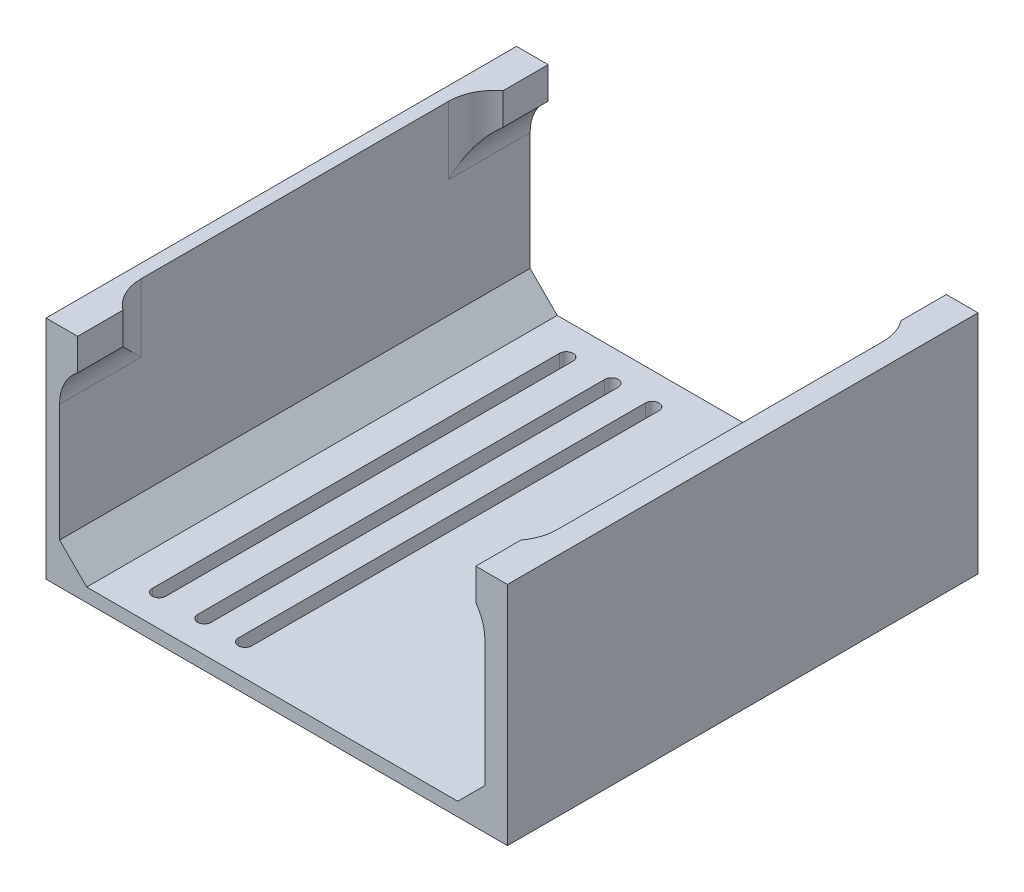
ISO-10303-21;
HEADER;
FILE_DESCRIPTION(('STEP AP214'),'2;1');
FILE_NAME('part.step','',(''),(''),'','','');
FILE_SCHEMA(('AUTOMOTIVE_DESIGN { 1 0 10303 214 1 1 1 1 }'));
ENDSEC;
DATA;
#1=APPLICATION_CONTEXT('core data for automotive mechanical design processes');
#2=APPLICATION_PROTOCOL_DEFINITION('international standard','automotive_design',2000,#1);
#3=PRODUCT_CONTEXT('',#1,'mechanical');
#4=PRODUCT('Part','Part','',(#3));
#5=PRODUCT_RELATED_PRODUCT_CATEGORY('part','',(#4));
#6=PRODUCT_DEFINITION_FORMATION('','',#4);
#7=PRODUCT_DEFINITION_CONTEXT('part definition',#1,'design');
#8=PRODUCT_DEFINITION('design','',#6,#7);
#9=PRODUCT_DEFINITION_SHAPE('','',#8);
#10=(LENGTH_UNIT() NAMED_UNIT(*) SI_UNIT(.MILLI.,.METRE.));
#11=(NAMED_UNIT(*) PLANE_ANGLE_UNIT() SI_UNIT($,.RADIAN.));
#12=(NAMED_UNIT(*) SI_UNIT($,.STERADIAN.) SOLID_ANGLE_UNIT());
#13=UNCERTAINTY_MEASURE_WITH_UNIT(LENGTH_MEASURE(1.E-05),#10,'distance_accuracy_value','');
#14=(GEOMETRIC_REPRESENTATION_CONTEXT(3) GLOBAL_UNCERTAINTY_ASSIGNED_CONTEXT((#13)) GLOBAL_UNIT_ASSIGNED_CONTEXT((#10,
#11,#12)) REPRESENTATION_CONTEXT('',''));
#15=CARTESIAN_POINT('',(0.,0.,0.));
#16=DIRECTION('',(0.,0.,1.));
#17=DIRECTION('',(1.,0.,0.));
#18=AXIS2_PLACEMENT_3D('',#15,#16,#17);
#19=CARTESIAN_POINT('',(52.,0.,0.));
#20=DIRECTION('',(1.,0.,0.));
#21=DIRECTION('',(0.,0.,-1.));
#22=AXIS2_PLACEMENT_3D('',#19,#20,#21);
#23=PLANE('',#22);
#24=DIRECTION('',(0.,1.,0.));
#25=VECTOR('',#24,1.);
#26=CARTESIAN_POINT('',(52.,-188.,107.));
#27=LINE('',#26,#25);
#28=CARTESIAN_POINT('',(52.,-50.,107.));
#29=VERTEX_POINT('',#28);
#30=CARTESIAN_POINT('',(52.,0.,107.));
#31=VERTEX_POINT('',#30);
#32=EDGE_CURVE('E376',#29,#31,#27,.T.);
#33=ORIENTED_EDGE('',*,*,#32,.F.);
#34=DIRECTION('',(0.,0.,1.));
#35=VECTOR('',#34,1.);
#36=CARTESIAN_POINT('',(52.,-50.,107.));
#37=LINE('',#36,#35);
#38=CARTESIAN_POINT('',(52.,-50.,3.));
#39=VERTEX_POINT('',#38);
#40=EDGE_CURVE('E374',#39,#29,#37,.T.);
#41=ORIENTED_EDGE('',*,*,#40,.F.);
#42=DIRECTION('',(0.,1.,0.));
#43=VECTOR('',#42,1.);
#44=CARTESIAN_POINT('',(52.,-188.,3.));
#45=LINE('',#44,#43);
#46=CARTESIAN_POINT('',(52.,0.,3.));
#47=VERTEX_POINT('',#46);
#48=EDGE_CURVE('E382',#39,#47,#45,.T.);
#49=ORIENTED_EDGE('',*,*,#48,.T.);
#50=DIRECTION('',(0.,0.,1.));
#51=VECTOR('',#50,1.);
#52=CARTESIAN_POINT('',(52.,0.,3.));
#53=LINE('',#52,#51);
#54=EDGE_CURVE('E379',#47,#31,#53,.T.);
#55=ORIENTED_EDGE('',*,*,#54,.T.);
#56=EDGE_LOOP('',(#33,#41,#49,#55));
#57=FACE_BOUND('',#56,.T.);
#58=ADVANCED_FACE('F36',(#57),#23,.T.);
#59=CARTESIAN_POINT('',(0.,-50.,0.));
#60=DIRECTION('',(0.,-1.,0.));
#61=DIRECTION('',(0.,0.,-1.));
#62=AXIS2_PLACEMENT_3D('',#59,#60,#61);
#63=PLANE('',#62);
#64=DIRECTION('',(0.,0.,1.));
#65=VECTOR('',#64,1.);
#66=CARTESIAN_POINT('',(-11.5,-50.,10.));
#67=LINE('',#66,#65);
#68=CARTESIAN_POINT('',(-11.5,-50.,10.));
#69=VERTEX_POINT('',#68);
#70=CARTESIAN_POINT('',(-11.5,-50.,100.));
#71=VERTEX_POINT('',#70);
#72=EDGE_CURVE('E305',#69,#71,#67,.T.);
#73=ORIENTED_EDGE('',*,*,#72,.F.);
#74=CARTESIAN_POINT('',(-13.,-50.,10.));
#75=DIRECTION('',(0.,-1.,0.));
#76=DIRECTION('',(0.,0.,-1.));
#77=AXIS2_PLACEMENT_3D('',#74,#75,#76);
#78=CIRCLE('',#77,1.5);
#79=CARTESIAN_POINT('',(-14.5,-50.,10.));
#80=VERTEX_POINT('',#79);
#81=EDGE_CURVE('E297',#80,#69,#78,.T.);
#82=ORIENTED_EDGE('',*,*,#81,.F.);
#83=DIRECTION('',(0.,0.,-1.));
#84=VECTOR('',#83,1.);
#85=CARTESIAN_POINT('',(-14.5,-50.,10.));
#86=LINE('',#85,#84);
#87=CARTESIAN_POINT('',(-14.5,-50.,100.));
#88=VERTEX_POINT('',#87);
#89=EDGE_CURVE('E311',#88,#80,#86,.T.);
#90=ORIENTED_EDGE('',*,*,#89,.F.);
#91=CARTESIAN_POINT('',(-13.,-50.,100.));
#92=DIRECTION('',(0.,-1.,0.));
#93=DIRECTION('',(0.,0.,-1.));
#94=AXIS2_PLACEMENT_3D('',#91,#92,#93);
#95=CIRCLE('',#94,1.5);
#96=EDGE_CURVE('E308',#71,#88,#95,.T.);
#97=ORIENTED_EDGE('',*,*,#96,.F.);
#98=EDGE_LOOP('',(#73,#82,#90,#97));
#99=FACE_BOUND('',#98,.T.);
#100=DIRECTION('',(0.,0.,1.));
#101=VECTOR('',#100,1.);
#102=CARTESIAN_POINT('',(-20.5,-50.,10.));
#103=LINE('',#102,#101);
#104=CARTESIAN_POINT('',(-20.5,-50.,10.));
#105=VERTEX_POINT('',#104);
#106=CARTESIAN_POINT('',(-20.5,-50.,100.));
#107=VERTEX_POINT('',#106);
#108=EDGE_CURVE('E285',#105,#107,#103,.T.);
#109=ORIENTED_EDGE('',*,*,#108,.F.);
#110=CARTESIAN_POINT('',(-22.,-50.,10.));
#111=DIRECTION('',(0.,-1.,0.));
#112=DIRECTION('',(0.,0.,-1.));
#113=AXIS2_PLACEMENT_3D('',#110,#111,#112);
#114=CIRCLE('',#113,1.5);
#115=CARTESIAN_POINT('',(-23.5,-50.,10.));
#116=VERTEX_POINT('',#115);
#117=EDGE_CURVE('E281',#116,#105,#114,.T.);
#118=ORIENTED_EDGE('',*,*,#117,.F.);
#119=DIRECTION('',(0.,0.,-1.));
#120=VECTOR('',#119,1.);
#121=CARTESIAN_POINT('',(-23.5,-50.,10.));
#122=LINE('',#121,#120);
#123=CARTESIAN_POINT('',(-23.5,-50.,100.));
#124=VERTEX_POINT('',#123);
#125=EDGE_CURVE('E291',#124,#116,#122,.T.);
#126=ORIENTED_EDGE('',*,*,#125,.F.);
#127=CARTESIAN_POINT('',(-22.,-50.,100.));
#128=DIRECTION('',(0.,-1.,0.));
#129=DIRECTION('',(0.,0.,-1.));
#130=AXIS2_PLACEMENT_3D('',#127,#128,#129);
#131=CIRCLE('',#130,1.5);
#132=EDGE_CURVE('E288',#107,#124,#131,.T.);
#133=ORIENTED_EDGE('',*,*,#132,.F.);
#134=EDGE_LOOP('',(#109,#118,#126,#133));
#135=FACE_BOUND('',#134,.T.);
#136=DIRECTION('',(0.,0.,1.));
#137=VECTOR('',#136,1.);
#138=CARTESIAN_POINT('',(-30.5,-50.,10.));
#139=LINE('',#138,#137);
#140=CARTESIAN_POINT('',(-30.5,-50.,10.));
#141=VERTEX_POINT('',#140);
#142=CARTESIAN_POINT('',(-30.5,-50.,100.));
#143=VERTEX_POINT('',#142);
#144=EDGE_CURVE('E268',#141,#143,#139,.T.);
#145=ORIENTED_EDGE('',*,*,#144,.F.);
#146=CARTESIAN_POINT('',(-32.,-50.,10.));
#147=DIRECTION('',(0.,-1.,0.));
#148=DIRECTION('',(0.,0.,-1.));
#149=AXIS2_PLACEMENT_3D('',#146,#147,#148);
#150=CIRCLE('',#149,1.5);
#151=CARTESIAN_POINT('',(-33.5,-50.,10.));
#152=VERTEX_POINT('',#151);
#153=EDGE_CURVE('E51',#152,#141,#150,.T.);
#154=ORIENTED_EDGE('',*,*,#153,.F.);
#155=DIRECTION('',(0.,0.,-1.));
#156=VECTOR('',#155,1.);
#157=CARTESIAN_POINT('',(-33.5,-50.,10.));
#158=LINE('',#157,#156);
#159=CARTESIAN_POINT('',(-33.5,-50.,100.));
#160=VERTEX_POINT('',#159);
#161=EDGE_CURVE('E274',#160,#152,#158,.T.);
#162=ORIENTED_EDGE('',*,*,#161,.F.);
#163=CARTESIAN_POINT('',(-32.,-50.,100.));
#164=DIRECTION('',(0.,-1.,0.));
#165=DIRECTION('',(0.,0.,-1.));
#166=AXIS2_PLACEMENT_3D('',#163,#164,#165);
#167=CIRCLE('',#166,1.49999999999999);
#168=EDGE_CURVE('E259',#143,#160,#167,.T.);
#169=ORIENTED_EDGE('',*,*,#168,.F.);
#170=EDGE_LOOP('',(#145,#154,#162,#169));
#171=FACE_BOUND('',#170,.T.);
#172=ORIENTED_EDGE('',*,*,#40,.T.);
#173=DIRECTION('',(-1.,0.,0.));
#174=VECTOR('',#173,1.);
#175=CARTESIAN_POINT('',(52.,-50.,107.));
#176=LINE('',#175,#174);
#177=CARTESIAN_POINT('',(-50.,-50.,107.));
#178=VERTEX_POINT('',#177);
#179=EDGE_CURVE('E373',#29,#178,#176,.T.);
#180=ORIENTED_EDGE('',*,*,#179,.T.);
#181=DIRECTION('',(0.,0.,-1.));
#182=VECTOR('',#181,1.);
#183=CARTESIAN_POINT('',(-50.,-50.,110.));
#184=LINE('',#183,#182);
#185=CARTESIAN_POINT('',(-50.,-50.,3.));
#186=VERTEX_POINT('',#185);
#187=EDGE_CURVE('E401',#178,#186,#184,.T.);
#188=ORIENTED_EDGE('',*,*,#187,.T.);
#189=DIRECTION('',(1.,0.,0.));
#190=VECTOR('',#189,1.);
#191=CARTESIAN_POINT('',(52.,-50.,3.));
#192=LINE('',#191,#190);
#193=EDGE_CURVE('E377',#186,#39,#192,.T.);
#194=ORIENTED_EDGE('',*,*,#193,.T.);
#195=EDGE_LOOP('',(#172,#180,#188,#194));
#196=FACE_BOUND('',#195,.T.);
#197=ADVANCED_FACE('F38',(#99,#135,#171,#196),#63,.T.);
#198=CARTESIAN_POINT('',(37.,0.,19.));
#199=DIRECTION('',(0.,1.,0.));
#200=DIRECTION('',(0.,0.,1.));
#201=AXIS2_PLACEMENT_3D('',#198,#199,#200);
#202=CYLINDRICAL_SURFACE('',#201,10.);
#203=CARTESIAN_POINT('',(37.,0.,19.));
#204=DIRECTION('',(0.,1.,0.));
#205=DIRECTION('',(0.,0.,1.));
#206=AXIS2_PLACEMENT_3D('',#203,#204,#205);
#207=CIRCLE('',#206,10.);
#208=CARTESIAN_POINT('',(45.,0.,13.));
#209=VERTEX_POINT('',#208);
#210=CARTESIAN_POINT('',(47.,0.,19.));
#211=VERTEX_POINT('',#210);
#212=EDGE_CURVE('E475',#209,#211,#207,.F.);
#213=ORIENTED_EDGE('',*,*,#212,.F.);
#214=DIRECTION('',(0.,-1.,0.));
#215=VECTOR('',#214,1.);
#216=CARTESIAN_POINT('',(45.,0.,13.));
#217=LINE('',#216,#215);
#218=CARTESIAN_POINT('',(45.,-7.,13.));
#219=VERTEX_POINT('',#218);
#220=EDGE_CURVE('E328',#209,#219,#217,.T.);
#221=ORIENTED_EDGE('',*,*,#220,.T.);
#222=CARTESIAN_POINT('',(37.,-13.,19.));
#223=DIRECTION('',(0.,0.707106781186547,0.707106781186547));
#224=DIRECTION('',(0.,0.707106781186547,-0.707106781186547));
#225=AXIS2_PLACEMENT_3D('',#222,#223,#224);
#226=ELLIPSE('',#225,14.1421356237309,10.);
#227=CARTESIAN_POINT('',(47.,-13.,19.));
#228=VERTEX_POINT('',#227);
#229=EDGE_CURVE('E317',#228,#219,#226,.T.);
#230=ORIENTED_EDGE('',*,*,#229,.F.);
#231=DIRECTION('',(0.,1.,0.));
#232=VECTOR('',#231,1.);
#233=CARTESIAN_POINT('',(47.,-47.,19.));
#234=LINE('',#233,#232);
#235=EDGE_CURVE('E458',#211,#228,#234,.F.);
#236=ORIENTED_EDGE('',*,*,#235,.F.);
#237=EDGE_LOOP('',(#213,#221,#230,#236));
#238=FACE_BOUND('',#237,.T.);
#239=ADVANCED_FACE('F612',(#238),#202,.F.);
#240=CARTESIAN_POINT('',(37.,0.,91.));
#241=DIRECTION('',(0.,-1.,0.));
#242=DIRECTION('',(0.,0.,-1.));
#243=AXIS2_PLACEMENT_3D('',#240,#241,#242);
#244=CYLINDRICAL_SURFACE('',#243,10.);
#245=CARTESIAN_POINT('',(37.,0.,91.));
#246=DIRECTION('',(0.,1.,0.));
#247=DIRECTION('',(0.,0.,1.));
#248=AXIS2_PLACEMENT_3D('',#245,#246,#247);
#249=CIRCLE('',#248,10.);
#250=CARTESIAN_POINT('',(47.,0.,91.));
#251=VERTEX_POINT('',#250);
#252=CARTESIAN_POINT('',(45.,0.,97.));
#253=VERTEX_POINT('',#252);
#254=EDGE_CURVE('E471',#251,#253,#249,.F.);
#255=ORIENTED_EDGE('',*,*,#254,.F.);
#256=DIRECTION('',(0.,-1.,0.));
#257=VECTOR('',#256,1.);
#258=CARTESIAN_POINT('',(47.,-47.,91.));
#259=LINE('',#258,#257);
#260=CARTESIAN_POINT('',(47.,-13.,91.));
#261=VERTEX_POINT('',#260);
#262=EDGE_CURVE('E465',#261,#251,#259,.F.);
#263=ORIENTED_EDGE('',*,*,#262,.F.);
#264=CARTESIAN_POINT('',(37.,-13.,91.));
#265=DIRECTION('',(0.,-0.707106781186547,0.707106781186547));
#266=DIRECTION('',(0.,-0.707106781186547,-0.707106781186547));
#267=AXIS2_PLACEMENT_3D('',#264,#265,#266);
#268=ELLIPSE('',#267,14.1421356237309,10.);
#269=CARTESIAN_POINT('',(45.,-7.,97.));
#270=VERTEX_POINT('',#269);
#271=EDGE_CURVE('E331',#270,#261,#268,.F.);
#272=ORIENTED_EDGE('',*,*,#271,.F.);
#273=DIRECTION('',(0.,1.,0.));
#274=VECTOR('',#273,1.);
#275=CARTESIAN_POINT('',(45.,0.,97.));
#276=LINE('',#275,#274);
#277=EDGE_CURVE('E324',#270,#253,#276,.T.);
#278=ORIENTED_EDGE('',*,*,#277,.T.);
#279=EDGE_LOOP('',(#255,#263,#272,#278));
#280=FACE_BOUND('',#279,.T.);
#281=ADVANCED_FACE('F607',(#280),#244,.F.);
#282=CARTESIAN_POINT('',(-37.,0.,89.));
#283=DIRECTION('',(0.,-1.,0.));
#284=DIRECTION('',(0.,0.,-1.));
#285=AXIS2_PLACEMENT_3D('',#282,#283,#284);
#286=CYLINDRICAL_SURFACE('',#285,10.);
#287=CARTESIAN_POINT('',(-37.,0.,89.));
#288=DIRECTION('',(0.,1.,0.));
#289=DIRECTION('',(0.,0.,1.));
#290=AXIS2_PLACEMENT_3D('',#287,#288,#289);
#291=CIRCLE('',#290,10.);
#292=CARTESIAN_POINT('',(-43.,0.,97.));
#293=VERTEX_POINT('',#292);
#294=CARTESIAN_POINT('',(-47.,0.,89.));
#295=VERTEX_POINT('',#294);
#296=EDGE_CURVE('E456',#293,#295,#291,.F.);
#297=ORIENTED_EDGE('',*,*,#296,.F.);
#298=DIRECTION('',(0.,-1.,0.));
#299=VECTOR('',#298,1.);
#300=CARTESIAN_POINT('',(-43.,0.,97.));
#301=LINE('',#300,#299);
#302=CARTESIAN_POINT('',(-43.,-7.,97.));
#303=VERTEX_POINT('',#302);
#304=EDGE_CURVE('E339',#293,#303,#301,.T.);
#305=ORIENTED_EDGE('',*,*,#304,.T.);
#306=CARTESIAN_POINT('',(-37.,-15.,89.));
#307=DIRECTION('',(0.,-0.707106781186547,0.707106781186547));
#308=DIRECTION('',(0.,-0.707106781186547,-0.707106781186547));
#309=AXIS2_PLACEMENT_3D('',#306,#307,#308);
#310=ELLIPSE('',#309,14.1421356237309,10.);
#311=CARTESIAN_POINT('',(-47.,-15.,89.));
#312=VERTEX_POINT('',#311);
#313=EDGE_CURVE('E334',#312,#303,#310,.F.);
#314=ORIENTED_EDGE('',*,*,#313,.F.);
#315=DIRECTION('',(0.,-1.,0.));
#316=VECTOR('',#315,1.);
#317=CARTESIAN_POINT('',(-47.,-47.,89.));
#318=LINE('',#317,#316);
#319=EDGE_CURVE('E442',#295,#312,#318,.T.);
#320=ORIENTED_EDGE('',*,*,#319,.F.);
#321=EDGE_LOOP('',(#297,#305,#314,#320));
#322=FACE_BOUND('',#321,.T.);
#323=ADVANCED_FACE('F578',(#322),#286,.F.);
#324=CARTESIAN_POINT('',(-37.,0.,21.));
#325=DIRECTION('',(0.,1.,0.));
#326=DIRECTION('',(0.,0.,1.));
#327=AXIS2_PLACEMENT_3D('',#324,#325,#326);
#328=CYLINDRICAL_SURFACE('',#327,10.);
#329=CARTESIAN_POINT('',(-37.,0.,21.));
#330=DIRECTION('',(0.,1.,0.));
#331=DIRECTION('',(0.,0.,1.));
#332=AXIS2_PLACEMENT_3D('',#329,#330,#331);
#333=CIRCLE('',#332,10.);
#334=CARTESIAN_POINT('',(-47.,0.,21.));
#335=VERTEX_POINT('',#334);
#336=CARTESIAN_POINT('',(-43.,0.,13.));
#337=VERTEX_POINT('',#336);
#338=EDGE_CURVE('E452',#335,#337,#333,.F.);
#339=ORIENTED_EDGE('',*,*,#338,.F.);
#340=DIRECTION('',(0.,1.,0.));
#341=VECTOR('',#340,1.);
#342=CARTESIAN_POINT('',(-47.,-47.,21.));
#343=LINE('',#342,#341);
#344=CARTESIAN_POINT('',(-47.,-15.,21.));
#345=VERTEX_POINT('',#344);
#346=EDGE_CURVE('E446',#345,#335,#343,.T.);
#347=ORIENTED_EDGE('',*,*,#346,.F.);
#348=CARTESIAN_POINT('',(-37.,-15.,21.));
#349=DIRECTION('',(0.,0.707106781186548,0.707106781186547));
#350=DIRECTION('',(0.,0.707106781186547,-0.707106781186548));
#351=AXIS2_PLACEMENT_3D('',#348,#349,#350);
#352=ELLIPSE('',#351,14.142135623731,10.);
#353=CARTESIAN_POINT('',(-43.,-7.,13.));
#354=VERTEX_POINT('',#353);
#355=EDGE_CURVE('E342',#354,#345,#352,.T.);
#356=ORIENTED_EDGE('',*,*,#355,.F.);
#357=DIRECTION('',(0.,1.,0.));
#358=VECTOR('',#357,1.);
#359=CARTESIAN_POINT('',(-43.,0.,13.));
#360=LINE('',#359,#358);
#361=EDGE_CURVE('E335',#354,#337,#360,.T.);
#362=ORIENTED_EDGE('',*,*,#361,.T.);
#363=EDGE_LOOP('',(#339,#347,#356,#362));
#364=FACE_BOUND('',#363,.T.);
#365=ADVANCED_FACE('F596',(#364),#328,.F.);
#366=CARTESIAN_POINT('',(45.,0.,-6.89949493661166));
#367=DIRECTION('',(-1.,0.,0.));
#368=DIRECTION('',(0.,0.,1.));
#369=AXIS2_PLACEMENT_3D('',#366,#367,#368);
#370=PLANE('',#369);
#371=ORIENTED_EDGE('',*,*,#220,.F.);
#372=DIRECTION('',(0.,0.,1.));
#373=VECTOR('',#372,1.);
#374=CARTESIAN_POINT('',(45.,0.,-6.89949493661166));
#375=LINE('',#374,#373);
#376=CARTESIAN_POINT('',(45.,0.,3.));
#377=VERTEX_POINT('',#376);
#378=EDGE_CURVE('E357',#377,#209,#375,.T.);
#379=ORIENTED_EDGE('',*,*,#378,.F.);
#380=DIRECTION('',(0.,1.,0.));
#381=VECTOR('',#380,1.);
#382=CARTESIAN_POINT('',(45.,0.,3.));
#383=LINE('',#382,#381);
#384=CARTESIAN_POINT('',(45.,-7.,3.));
#385=VERTEX_POINT('',#384);
#386=EDGE_CURVE('E346',#385,#377,#383,.T.);
#387=ORIENTED_EDGE('',*,*,#386,.F.);
#388=DIRECTION('',(0.,0.,1.));
#389=VECTOR('',#388,1.);
#390=CARTESIAN_POINT('',(45.,-7.,-6.89949493661166));
#391=LINE('',#390,#389);
#392=EDGE_CURVE('E350',#385,#219,#391,.T.);
#393=ORIENTED_EDGE('',*,*,#392,.T.);
#394=EDGE_LOOP('',(#371,#379,#387,#393));
#395=FACE_BOUND('',#394,.T.);
#396=ADVANCED_FACE('F598',(#395),#370,.T.);
#397=CARTESIAN_POINT('',(37.,-13.,-6.89949493661165));
#398=DIRECTION('',(0.,0.,1.));
#399=DIRECTION('',(1.,0.,0.));
#400=AXIS2_PLACEMENT_3D('',#397,#398,#399);
#401=CYLINDRICAL_SURFACE('',#400,10.);
#402=CARTESIAN_POINT('',(37.,-13.,3.));
#403=DIRECTION('',(0.,0.,1.));
#404=DIRECTION('',(1.,0.,0.));
#405=AXIS2_PLACEMENT_3D('',#402,#403,#404);
#406=CIRCLE('',#405,10.);
#407=CARTESIAN_POINT('',(47.,-13.,3.));
#408=VERTEX_POINT('',#407);
#409=EDGE_CURVE('E473',#408,#385,#406,.T.);
#410=ORIENTED_EDGE('',*,*,#409,.F.);
#411=DIRECTION('',(0.,0.,1.));
#412=VECTOR('',#411,1.);
#413=CARTESIAN_POINT('',(47.,-13.,3.));
#414=LINE('',#413,#412);
#415=EDGE_CURVE('E463',#228,#408,#414,.F.);
#416=ORIENTED_EDGE('',*,*,#415,.F.);
#417=ORIENTED_EDGE('',*,*,#229,.T.);
#418=ORIENTED_EDGE('',*,*,#392,.F.);
#419=EDGE_LOOP('',(#410,#416,#417,#418));
#420=FACE_BOUND('',#419,.T.);
#421=ADVANCED_FACE('F604',(#420),#401,.F.);
#422=CARTESIAN_POINT('',(-37.,-15.,-6.89949493661166));
#423=DIRECTION('',(0.,0.,1.));
#424=DIRECTION('',(1.,0.,0.));
#425=AXIS2_PLACEMENT_3D('',#422,#423,#424);
#426=CYLINDRICAL_SURFACE('',#425,10.);
#427=ORIENTED_EDGE('',*,*,#355,.T.);
#428=DIRECTION('',(0.,0.,1.));
#429=VECTOR('',#428,1.);
#430=CARTESIAN_POINT('',(-47.,-15.,3.));
#431=LINE('',#430,#429);
#432=CARTESIAN_POINT('',(-47.,-15.,3.));
#433=VERTEX_POINT('',#432);
#434=EDGE_CURVE('E448',#433,#345,#431,.T.);
#435=ORIENTED_EDGE('',*,*,#434,.F.);
#436=CARTESIAN_POINT('',(-37.,-15.,3.));
#437=DIRECTION('',(0.,0.,1.));
#438=DIRECTION('',(1.,0.,0.));
#439=AXIS2_PLACEMENT_3D('',#436,#437,#438);
#440=CIRCLE('',#439,10.);
#441=CARTESIAN_POINT('',(-43.,-7.,3.));
#442=VERTEX_POINT('',#441);
#443=EDGE_CURVE('E450',#442,#433,#440,.T.);
#444=ORIENTED_EDGE('',*,*,#443,.F.);
#445=DIRECTION('',(0.,0.,1.));
#446=VECTOR('',#445,1.);
#447=CARTESIAN_POINT('',(-43.,-7.,-6.89949493661166));
#448=LINE('',#447,#446);
#449=EDGE_CURVE('E368',#442,#354,#448,.T.);
#450=ORIENTED_EDGE('',*,*,#449,.T.);
#451=EDGE_LOOP('',(#427,#435,#444,#450));
#452=FACE_BOUND('',#451,.T.);
#453=ADVANCED_FACE('F593',(#452),#426,.F.);
#454=CARTESIAN_POINT('',(-43.,0.,-6.89949493661166));
#455=DIRECTION('',(-1.,0.,0.));
#456=DIRECTION('',(0.,0.,1.));
#457=AXIS2_PLACEMENT_3D('',#454,#455,#456);
#458=PLANE('',#457);
#459=DIRECTION('',(0.,0.,1.));
#460=VECTOR('',#459,1.);
#461=CARTESIAN_POINT('',(-43.,0.,-6.89949493661166));
#462=LINE('',#461,#460);
#463=CARTESIAN_POINT('',(-43.,0.,3.));
#464=VERTEX_POINT('',#463);
#465=EDGE_CURVE('E363',#464,#337,#462,.T.);
#466=ORIENTED_EDGE('',*,*,#465,.T.);
#467=ORIENTED_EDGE('',*,*,#361,.F.);
#468=ORIENTED_EDGE('',*,*,#449,.F.);
#469=DIRECTION('',(0.,1.,0.));
#470=VECTOR('',#469,1.);
#471=CARTESIAN_POINT('',(-43.,0.,3.));
#472=LINE('',#471,#470);
#473=EDGE_CURVE('E366',#442,#464,#472,.T.);
#474=ORIENTED_EDGE('',*,*,#473,.T.);
#475=EDGE_LOOP('',(#466,#467,#468,#474));
#476=FACE_BOUND('',#475,.T.);
#477=ADVANCED_FACE('F589',(#476),#458,.F.);
#478=CARTESIAN_POINT('',(-43.,-7.,107.));
#479=VERTEX_POINT('',#478);
#480=EDGE_CURVE('E362',#303,#479,#448,.T.);
#481=ORIENTED_EDGE('',*,*,#480,.F.);
#482=ORIENTED_EDGE('',*,*,#304,.F.);
#483=CARTESIAN_POINT('',(-43.,0.,107.));
#484=VERTEX_POINT('',#483);
#485=EDGE_CURVE('E367',#293,#484,#462,.T.);
#486=ORIENTED_EDGE('',*,*,#485,.T.);
#487=DIRECTION('',(0.,-1.,0.));
#488=VECTOR('',#487,1.);
#489=CARTESIAN_POINT('',(-43.,0.,107.));
#490=LINE('',#489,#488);
#491=EDGE_CURVE('E349',#484,#479,#490,.T.);
#492=ORIENTED_EDGE('',*,*,#491,.T.);
#493=EDGE_LOOP('',(#481,#482,#486,#492));
#494=FACE_BOUND('',#493,.T.);
#495=ADVANCED_FACE('F582',(#494),#458,.F.);
#496=CARTESIAN_POINT('',(-37.,-15.,-6.89949493661166));
#497=DIRECTION('',(0.,0.,1.));
#498=DIRECTION('',(1.,0.,0.));
#499=AXIS2_PLACEMENT_3D('',#496,#497,#498);
#500=CYLINDRICAL_SURFACE('',#499,10.);
#501=CARTESIAN_POINT('',(-37.,-15.,107.));
#502=DIRECTION('',(0.,0.,-1.));
#503=DIRECTION('',(-1.,0.,0.));
#504=AXIS2_PLACEMENT_3D('',#501,#502,#503);
#505=CIRCLE('',#504,10.);
#506=CARTESIAN_POINT('',(-47.,-15.,107.));
#507=VERTEX_POINT('',#506);
#508=EDGE_CURVE('E454',#507,#479,#505,.T.);
#509=ORIENTED_EDGE('',*,*,#508,.F.);
#510=DIRECTION('',(0.,0.,1.));
#511=VECTOR('',#510,1.);
#512=CARTESIAN_POINT('',(-47.,-15.,3.));
#513=LINE('',#512,#511);
#514=EDGE_CURVE('E444',#312,#507,#513,.T.);
#515=ORIENTED_EDGE('',*,*,#514,.F.);
#516=ORIENTED_EDGE('',*,*,#313,.T.);
#517=ORIENTED_EDGE('',*,*,#480,.T.);
#518=EDGE_LOOP('',(#509,#515,#516,#517));
#519=FACE_BOUND('',#518,.T.);
#520=ADVANCED_FACE('F574',(#519),#500,.F.);
#521=CARTESIAN_POINT('',(-47.,-47.,3.));
#522=DIRECTION('',(-1.,0.,0.));
#523=DIRECTION('',(0.,0.,1.));
#524=AXIS2_PLACEMENT_3D('',#521,#522,#523);
#525=PLANE('',#524);
#526=DIRECTION('',(0.,1.,0.));
#527=VECTOR('',#526,1.);
#528=CARTESIAN_POINT('',(-47.,-47.,3.));
#529=LINE('',#528,#527);
#530=CARTESIAN_POINT('',(-47.,-41.,3.));
#531=VERTEX_POINT('',#530);
#532=EDGE_CURVE('E393',#531,#433,#529,.T.);
#533=ORIENTED_EDGE('',*,*,#532,.T.);
#534=ORIENTED_EDGE('',*,*,#434,.T.);
#535=ORIENTED_EDGE('',*,*,#346,.T.);
#536=DIRECTION('',(0.,0.,1.));
#537=VECTOR('',#536,1.);
#538=CARTESIAN_POINT('',(-47.,0.,97.));
#539=LINE('',#538,#537);
#540=EDGE_CURVE('E338',#335,#295,#539,.T.);
#541=ORIENTED_EDGE('',*,*,#540,.T.);
#542=ORIENTED_EDGE('',*,*,#319,.T.);
#543=ORIENTED_EDGE('',*,*,#514,.T.);
#544=DIRECTION('',(0.,1.,0.));
#545=VECTOR('',#544,1.);
#546=CARTESIAN_POINT('',(-47.,-47.,107.));
#547=LINE('',#546,#545);
#548=CARTESIAN_POINT('',(-47.,-41.,107.));
#549=VERTEX_POINT('',#548);
#550=EDGE_CURVE('E384',#549,#507,#547,.T.);
#551=ORIENTED_EDGE('',*,*,#550,.F.);
#552=DIRECTION('',(0.,0.,-1.));
#553=VECTOR('',#552,1.);
#554=CARTESIAN_POINT('',(-47.,-41.,3.));
#555=LINE('',#554,#553);
#556=EDGE_CURVE('E426',#549,#531,#555,.T.);
#557=ORIENTED_EDGE('',*,*,#556,.T.);
#558=EDGE_LOOP('',(#533,#534,#535,#541,#542,#543,#551,#557));
#559=FACE_BOUND('',#558,.T.);
#560=ADVANCED_FACE('F568',(#559),#525,.F.);
#561=CARTESIAN_POINT('',(-40.9999999999999,-47.,0.));
#562=DIRECTION('',(-0.707106781186543,-0.707106781186552,0.));
#563=DIRECTION('',(0.,0.,1.));
#564=AXIS2_PLACEMENT_3D('',#561,#562,#563);
#565=PLANE('',#564);
#566=DIRECTION('',(0.707106781186552,-0.707106781186543,0.));
#567=VECTOR('',#566,1.);
#568=CARTESIAN_POINT('',(-43.9999999999997,-44.0000000000003,3.));
#569=LINE('',#568,#567);
#570=CARTESIAN_POINT('',(-40.9999999999999,-47.,3.));
#571=VERTEX_POINT('',#570);
#572=EDGE_CURVE('E430',#531,#571,#569,.T.);
#573=ORIENTED_EDGE('',*,*,#572,.F.);
#574=ORIENTED_EDGE('',*,*,#556,.F.);
#575=DIRECTION('',(-0.707106781186552,0.707106781186543,0.));
#576=VECTOR('',#575,1.);
#577=CARTESIAN_POINT('',(-43.9999999999997,-44.0000000000003,107.));
#578=LINE('',#577,#576);
#579=CARTESIAN_POINT('',(-40.9999999999999,-47.,107.));
#580=VERTEX_POINT('',#579);
#581=EDGE_CURVE('E428',#580,#549,#578,.T.);
#582=ORIENTED_EDGE('',*,*,#581,.F.);
#583=DIRECTION('',(0.,0.,1.));
#584=VECTOR('',#583,1.);
#585=CARTESIAN_POINT('',(-40.9999999999999,-47.,0.));
#586=LINE('',#585,#584);
#587=EDGE_CURVE('E397',#571,#580,#586,.T.);
#588=ORIENTED_EDGE('',*,*,#587,.F.);
#589=EDGE_LOOP('',(#573,#574,#582,#588));
#590=FACE_BOUND('',#589,.T.);
#591=ADVANCED_FACE('F563',(#590),#565,.F.);
#592=CARTESIAN_POINT('',(-14.5,-40.,10.));
#593=DIRECTION('',(-1.,0.,0.));
#594=DIRECTION('',(0.,0.,1.));
#595=AXIS2_PLACEMENT_3D('',#592,#593,#594);
#596=PLANE('',#595);
#597=DIRECTION('',(0.,0.,1.));
#598=VECTOR('',#597,1.);
#599=CARTESIAN_POINT('',(-14.5,-47.,0.));
#600=LINE('',#599,#598);
#601=CARTESIAN_POINT('',(-14.5,-47.,10.));
#602=VERTEX_POINT('',#601);
#603=CARTESIAN_POINT('',(-14.5,-47.,100.));
#604=VERTEX_POINT('',#603);
#605=EDGE_CURVE('E485',#602,#604,#600,.T.);
#606=ORIENTED_EDGE('',*,*,#605,.T.);
#607=DIRECTION('',(0.,-1.,0.));
#608=VECTOR('',#607,1.);
#609=CARTESIAN_POINT('',(-14.5,-40.,100.));
#610=LINE('',#609,#608);
#611=EDGE_CURVE('E318',#604,#88,#610,.T.);
#612=ORIENTED_EDGE('',*,*,#611,.T.);
#613=ORIENTED_EDGE('',*,*,#89,.T.);
#614=DIRECTION('',(0.,-1.,0.));
#615=VECTOR('',#614,1.);
#616=CARTESIAN_POINT('',(-14.5,-40.,10.));
#617=LINE('',#616,#615);
#618=EDGE_CURVE('E315',#602,#80,#617,.T.);
#619=ORIENTED_EDGE('',*,*,#618,.F.);
#620=EDGE_LOOP('',(#606,#612,#613,#619));
#621=FACE_BOUND('',#620,.T.);
#622=ADVANCED_FACE('F659',(#621),#596,.F.);
#623=CARTESIAN_POINT('',(-13.,-40.,100.));
#624=DIRECTION('',(0.,-1.,0.));
#625=DIRECTION('',(0.,0.,-1.));
#626=AXIS2_PLACEMENT_3D('',#623,#624,#625);
#627=CYLINDRICAL_SURFACE('',#626,1.5);
#628=CARTESIAN_POINT('',(-13.,-47.,100.));
#629=DIRECTION('',(0.,1.,0.));
#630=DIRECTION('',(0.,0.,1.));
#631=AXIS2_PLACEMENT_3D('',#628,#629,#630);
#632=CIRCLE('',#631,1.5);
#633=CARTESIAN_POINT('',(-11.5,-47.,100.));
#634=VERTEX_POINT('',#633);
#635=EDGE_CURVE('E482',#604,#634,#632,.T.);
#636=ORIENTED_EDGE('',*,*,#635,.T.);
#637=DIRECTION('',(0.,-1.,0.));
#638=VECTOR('',#637,1.);
#639=CARTESIAN_POINT('',(-11.5,-40.,100.));
#640=LINE('',#639,#638);
#641=EDGE_CURVE('E320',#634,#71,#640,.T.);
#642=ORIENTED_EDGE('',*,*,#641,.T.);
#643=ORIENTED_EDGE('',*,*,#96,.T.);
#644=ORIENTED_EDGE('',*,*,#611,.F.);
#645=EDGE_LOOP('',(#636,#642,#643,#644));
#646=FACE_BOUND('',#645,.T.);
#647=ADVANCED_FACE('F662',(#646),#627,.F.);
#648=CARTESIAN_POINT('',(-13.,-40.,10.));
#649=DIRECTION('',(0.,-1.,0.));
#650=DIRECTION('',(0.,0.,-1.));
#651=AXIS2_PLACEMENT_3D('',#648,#649,#650);
#652=CYLINDRICAL_SURFACE('',#651,1.5);
#653=CARTESIAN_POINT('',(-13.,-47.,10.));
#654=DIRECTION('',(0.,1.,0.));
#655=DIRECTION('',(0.,0.,1.));
#656=AXIS2_PLACEMENT_3D('',#653,#654,#655);
#657=CIRCLE('',#656,1.5);
#658=CARTESIAN_POINT('',(-11.5,-47.,10.));
#659=VERTEX_POINT('',#658);
#660=EDGE_CURVE('E487',#659,#602,#657,.T.);
#661=ORIENTED_EDGE('',*,*,#660,.T.);
#662=ORIENTED_EDGE('',*,*,#618,.T.);
#663=ORIENTED_EDGE('',*,*,#81,.T.);
#664=DIRECTION('',(0.,-1.,0.));
#665=VECTOR('',#664,1.);
#666=CARTESIAN_POINT('',(-11.5,-40.,10.));
#667=LINE('',#666,#665);
#668=EDGE_CURVE('E314',#659,#69,#667,.T.);
#669=ORIENTED_EDGE('',*,*,#668,.F.);
#670=EDGE_LOOP('',(#661,#662,#663,#669));
#671=FACE_BOUND('',#670,.T.);
#672=ADVANCED_FACE('F652',(#671),#652,.F.);
#673=CARTESIAN_POINT('',(-23.5,-40.,10.));
#674=DIRECTION('',(-1.,0.,0.));
#675=DIRECTION('',(0.,0.,1.));
#676=AXIS2_PLACEMENT_3D('',#673,#674,#675);
#677=PLANE('',#676);
#678=DIRECTION('',(0.,0.,1.));
#679=VECTOR('',#678,1.);
#680=CARTESIAN_POINT('',(-23.5,-47.,0.));
#681=LINE('',#680,#679);
#682=CARTESIAN_POINT('',(-23.5,-47.,10.));
#683=VERTEX_POINT('',#682);
#684=CARTESIAN_POINT('',(-23.5,-47.,100.));
#685=VERTEX_POINT('',#684);
#686=EDGE_CURVE('E494',#683,#685,#681,.T.);
#687=ORIENTED_EDGE('',*,*,#686,.T.);
#688=DIRECTION('',(0.,-1.,0.));
#689=VECTOR('',#688,1.);
#690=CARTESIAN_POINT('',(-23.5,-40.,100.));
#691=LINE('',#690,#689);
#692=EDGE_CURVE('E298',#685,#124,#691,.T.);
#693=ORIENTED_EDGE('',*,*,#692,.T.);
#694=ORIENTED_EDGE('',*,*,#125,.T.);
#695=DIRECTION('',(0.,-1.,0.));
#696=VECTOR('',#695,1.);
#697=CARTESIAN_POINT('',(-23.5,-40.,10.));
#698=LINE('',#697,#696);
#699=EDGE_CURVE('E295',#683,#116,#698,.T.);
#700=ORIENTED_EDGE('',*,*,#699,.F.);
#701=EDGE_LOOP('',(#687,#693,#694,#700));
#702=FACE_BOUND('',#701,.T.);
#703=ADVANCED_FACE('F642',(#702),#677,.F.);
#704=CARTESIAN_POINT('',(-22.,-40.,100.));
#705=DIRECTION('',(0.,-1.,0.));
#706=DIRECTION('',(0.,0.,-1.));
#707=AXIS2_PLACEMENT_3D('',#704,#705,#706);
#708=CYLINDRICAL_SURFACE('',#707,1.5);
#709=CARTESIAN_POINT('',(-22.,-47.,100.));
#710=DIRECTION('',(0.,1.,0.));
#711=DIRECTION('',(0.,0.,1.));
#712=AXIS2_PLACEMENT_3D('',#709,#710,#711);
#713=CIRCLE('',#712,1.5);
#714=CARTESIAN_POINT('',(-20.5,-47.,100.));
#715=VERTEX_POINT('',#714);
#716=EDGE_CURVE('E491',#685,#715,#713,.T.);
#717=ORIENTED_EDGE('',*,*,#716,.T.);
#718=DIRECTION('',(0.,-1.,0.));
#719=VECTOR('',#718,1.);
#720=CARTESIAN_POINT('',(-20.5,-40.,100.));
#721=LINE('',#720,#719);
#722=EDGE_CURVE('E300',#715,#107,#721,.T.);
#723=ORIENTED_EDGE('',*,*,#722,.T.);
#724=ORIENTED_EDGE('',*,*,#132,.T.);
#725=ORIENTED_EDGE('',*,*,#692,.F.);
#726=EDGE_LOOP('',(#717,#723,#724,#725));
#727=FACE_BOUND('',#726,.T.);
#728=ADVANCED_FACE('F644',(#727),#708,.F.);
#729=CARTESIAN_POINT('',(-22.,-40.,10.));
#730=DIRECTION('',(0.,-1.,0.));
#731=DIRECTION('',(0.,0.,-1.));
#732=AXIS2_PLACEMENT_3D('',#729,#730,#731);
#733=CYLINDRICAL_SURFACE('',#732,1.5);
#734=CARTESIAN_POINT('',(-22.,-47.,10.));
#735=DIRECTION('',(0.,1.,0.));
#736=DIRECTION('',(0.,0.,1.));
#737=AXIS2_PLACEMENT_3D('',#734,#735,#736);
#738=CIRCLE('',#737,1.5);
#739=CARTESIAN_POINT('',(-20.5,-47.,10.));
#740=VERTEX_POINT('',#739);
#741=EDGE_CURVE('E496',#740,#683,#738,.T.);
#742=ORIENTED_EDGE('',*,*,#741,.T.);
#743=ORIENTED_EDGE('',*,*,#699,.T.);
#744=ORIENTED_EDGE('',*,*,#117,.T.);
#745=DIRECTION('',(0.,-1.,0.));
#746=VECTOR('',#745,1.);
#747=CARTESIAN_POINT('',(-20.5,-40.,10.));
#748=LINE('',#747,#746);
#749=EDGE_CURVE('E294',#740,#105,#748,.T.);
#750=ORIENTED_EDGE('',*,*,#749,.F.);
#751=EDGE_LOOP('',(#742,#743,#744,#750));
#752=FACE_BOUND('',#751,.T.);
#753=ADVANCED_FACE('F635',(#752),#733,.F.);
#754=CARTESIAN_POINT('',(-33.5,-40.,10.));
#755=DIRECTION('',(-1.,0.,0.));
#756=DIRECTION('',(0.,0.,1.));
#757=AXIS2_PLACEMENT_3D('',#754,#755,#756);
#758=PLANE('',#757);
#759=DIRECTION('',(0.,0.,1.));
#760=VECTOR('',#759,1.);
#761=CARTESIAN_POINT('',(-33.5,-47.,0.));
#762=LINE('',#761,#760);
#763=CARTESIAN_POINT('',(-33.5,-47.,10.));
#764=VERTEX_POINT('',#763);
#765=CARTESIAN_POINT('',(-33.5,-47.,100.));
#766=VERTEX_POINT('',#765);
#767=EDGE_CURVE('E44',#764,#766,#762,.T.);
#768=ORIENTED_EDGE('',*,*,#767,.T.);
#769=DIRECTION('',(0.,-1.,0.));
#770=VECTOR('',#769,1.);
#771=CARTESIAN_POINT('',(-33.5,-40.,100.));
#772=LINE('',#771,#770);
#773=EDGE_CURVE('E264',#766,#160,#772,.T.);
#774=ORIENTED_EDGE('',*,*,#773,.T.);
#775=ORIENTED_EDGE('',*,*,#161,.T.);
#776=DIRECTION('',(0.,-1.,0.));
#777=VECTOR('',#776,1.);
#778=CARTESIAN_POINT('',(-33.5,-40.,10.));
#779=LINE('',#778,#777);
#780=EDGE_CURVE('E279',#764,#152,#779,.T.);
#781=ORIENTED_EDGE('',*,*,#780,.F.);
#782=EDGE_LOOP('',(#768,#774,#775,#781));
#783=FACE_BOUND('',#782,.T.);
#784=ADVANCED_FACE('F503',(#783),#758,.F.);
#785=CARTESIAN_POINT('',(-32.,-40.,100.));
#786=DIRECTION('',(0.,-1.,0.));
#787=DIRECTION('',(0.,0.,-1.));
#788=AXIS2_PLACEMENT_3D('',#785,#786,#787);
#789=CYLINDRICAL_SURFACE('',#788,1.49999999999999);
#790=CARTESIAN_POINT('',(-32.,-47.,100.));
#791=DIRECTION('',(0.,1.,0.));
#792=DIRECTION('',(0.,0.,1.));
#793=AXIS2_PLACEMENT_3D('',#790,#791,#792);
#794=CIRCLE('',#793,1.49999999999999);
#795=CARTESIAN_POINT('',(-30.5,-47.,100.));
#796=VERTEX_POINT('',#795);
#797=EDGE_CURVE('E262',#766,#796,#794,.T.);
#798=ORIENTED_EDGE('',*,*,#797,.T.);
#799=DIRECTION('',(0.,-1.,0.));
#800=VECTOR('',#799,1.);
#801=CARTESIAN_POINT('',(-30.5,-40.,100.));
#802=LINE('',#801,#800);
#803=EDGE_CURVE('E59',#796,#143,#802,.T.);
#804=ORIENTED_EDGE('',*,*,#803,.T.);
#805=ORIENTED_EDGE('',*,*,#168,.T.);
#806=ORIENTED_EDGE('',*,*,#773,.F.);
#807=EDGE_LOOP('',(#798,#804,#805,#806));
#808=FACE_BOUND('',#807,.T.);
#809=ADVANCED_FACE('F256',(#808),#789,.F.);
#810=CARTESIAN_POINT('',(-32.,-40.,10.));
#811=DIRECTION('',(0.,-1.,0.));
#812=DIRECTION('',(0.,0.,-1.));
#813=AXIS2_PLACEMENT_3D('',#810,#811,#812);
#814=CYLINDRICAL_SURFACE('',#813,1.5);
#815=CARTESIAN_POINT('',(-32.,-47.,10.));
#816=DIRECTION('',(0.,1.,0.));
#817=DIRECTION('',(0.,0.,1.));
#818=AXIS2_PLACEMENT_3D('',#815,#816,#817);
#819=CIRCLE('',#818,1.5);
#820=CARTESIAN_POINT('',(-30.5,-47.,10.));
#821=VERTEX_POINT('',#820);
#822=EDGE_CURVE('E11',#821,#764,#819,.T.);
#823=ORIENTED_EDGE('',*,*,#822,.T.);
#824=ORIENTED_EDGE('',*,*,#780,.T.);
#825=ORIENTED_EDGE('',*,*,#153,.T.);
#826=DIRECTION('',(0.,-1.,0.));
#827=VECTOR('',#826,1.);
#828=CARTESIAN_POINT('',(-30.5,-40.,10.));
#829=LINE('',#828,#827);
#830=EDGE_CURVE('E265',#821,#141,#829,.T.);
#831=ORIENTED_EDGE('',*,*,#830,.F.);
#832=EDGE_LOOP('',(#823,#824,#825,#831));
#833=FACE_BOUND('',#832,.T.);
#834=ADVANCED_FACE('F508',(#833),#814,.F.);
#835=CARTESIAN_POINT('',(0.,-47.,0.));
#836=DIRECTION('',(0.,1.,0.));
#837=DIRECTION('',(0.,0.,1.));
#838=AXIS2_PLACEMENT_3D('',#835,#836,#837);
#839=PLANE('',#838);
#840=ORIENTED_EDGE('',*,*,#822,.F.);
#841=DIRECTION('',(0.,0.,-1.));
#842=VECTOR('',#841,1.);
#843=CARTESIAN_POINT('',(-30.5,-47.,0.));
#844=LINE('',#843,#842);
#845=EDGE_CURVE('E498',#796,#821,#844,.T.);
#846=ORIENTED_EDGE('',*,*,#845,.F.);
#847=ORIENTED_EDGE('',*,*,#797,.F.);
#848=ORIENTED_EDGE('',*,*,#767,.F.);
#849=EDGE_LOOP('',(#840,#846,#847,#848));
#850=FACE_BOUND('',#849,.T.);
#851=ORIENTED_EDGE('',*,*,#741,.F.);
#852=DIRECTION('',(0.,0.,-1.));
#853=VECTOR('',#852,1.);
#854=CARTESIAN_POINT('',(-20.5,-47.,0.));
#855=LINE('',#854,#853);
#856=EDGE_CURVE('E489',#715,#740,#855,.T.);
#857=ORIENTED_EDGE('',*,*,#856,.F.);
#858=ORIENTED_EDGE('',*,*,#716,.F.);
#859=ORIENTED_EDGE('',*,*,#686,.F.);
#860=EDGE_LOOP('',(#851,#857,#858,#859));
#861=FACE_BOUND('',#860,.T.);
#862=ORIENTED_EDGE('',*,*,#660,.F.);
#863=DIRECTION('',(0.,0.,-1.));
#864=VECTOR('',#863,1.);
#865=CARTESIAN_POINT('',(-11.5,-47.,0.));
#866=LINE('',#865,#864);
#867=EDGE_CURVE('E477',#634,#659,#866,.T.);
#868=ORIENTED_EDGE('',*,*,#867,.F.);
#869=ORIENTED_EDGE('',*,*,#635,.F.);
#870=ORIENTED_EDGE('',*,*,#605,.F.);
#871=EDGE_LOOP('',(#862,#868,#869,#870));
#872=FACE_BOUND('',#871,.T.);
#873=DIRECTION('',(1.,0.,0.));
#874=VECTOR('',#873,1.);
#875=CARTESIAN_POINT('',(-47.,-47.,107.));
#876=LINE('',#875,#874);
#877=CARTESIAN_POINT('',(41.,-47.,107.));
#878=VERTEX_POINT('',#877);
#879=EDGE_CURVE('E394',#580,#878,#876,.T.);
#880=ORIENTED_EDGE('',*,*,#879,.T.);
#881=DIRECTION('',(0.,0.,-1.));
#882=VECTOR('',#881,1.);
#883=CARTESIAN_POINT('',(40.9999999999999,-47.,0.));
#884=LINE('',#883,#882);
#885=CARTESIAN_POINT('',(40.9999999999999,-47.,3.));
#886=VERTEX_POINT('',#885);
#887=EDGE_CURVE('E433',#878,#886,#884,.T.);
#888=ORIENTED_EDGE('',*,*,#887,.T.);
#889=DIRECTION('',(-1.,0.,0.));
#890=VECTOR('',#889,1.);
#891=CARTESIAN_POINT('',(-47.,-47.,3.));
#892=LINE('',#891,#890);
#893=EDGE_CURVE('E392',#886,#571,#892,.T.);
#894=ORIENTED_EDGE('',*,*,#893,.T.);
#895=ORIENTED_EDGE('',*,*,#587,.T.);
#896=EDGE_LOOP('',(#880,#888,#894,#895));
#897=FACE_BOUND('',#896,.T.);
#898=ADVANCED_FACE('F506',(#850,#861,#872,#897),#839,.T.);
#899=CARTESIAN_POINT('',(-30.5,-40.,10.));
#900=DIRECTION('',(1.,0.,0.));
#901=DIRECTION('',(0.,0.,-1.));
#902=AXIS2_PLACEMENT_3D('',#899,#900,#901);
#903=PLANE('',#902);
#904=ORIENTED_EDGE('',*,*,#845,.T.);
#905=ORIENTED_EDGE('',*,*,#830,.T.);
#906=ORIENTED_EDGE('',*,*,#144,.T.);
#907=ORIENTED_EDGE('',*,*,#803,.F.);
#908=EDGE_LOOP('',(#904,#905,#906,#907));
#909=FACE_BOUND('',#908,.T.);
#910=ADVANCED_FACE('F269',(#909),#903,.F.);
#911=CARTESIAN_POINT('',(-20.5,-40.,10.));
#912=DIRECTION('',(1.,0.,0.));
#913=DIRECTION('',(0.,0.,-1.));
#914=AXIS2_PLACEMENT_3D('',#911,#912,#913);
#915=PLANE('',#914);
#916=ORIENTED_EDGE('',*,*,#856,.T.);
#917=ORIENTED_EDGE('',*,*,#749,.T.);
#918=ORIENTED_EDGE('',*,*,#108,.T.);
#919=ORIENTED_EDGE('',*,*,#722,.F.);
#920=EDGE_LOOP('',(#916,#917,#918,#919));
#921=FACE_BOUND('',#920,.T.);
#922=ADVANCED_FACE('F630',(#921),#915,.F.);
#923=CARTESIAN_POINT('',(-11.5,-40.,10.));
#924=DIRECTION('',(1.,0.,0.));
#925=DIRECTION('',(0.,0.,-1.));
#926=AXIS2_PLACEMENT_3D('',#923,#924,#925);
#927=PLANE('',#926);
#928=ORIENTED_EDGE('',*,*,#867,.T.);
#929=ORIENTED_EDGE('',*,*,#668,.T.);
#930=ORIENTED_EDGE('',*,*,#72,.T.);
#931=ORIENTED_EDGE('',*,*,#641,.F.);
#932=EDGE_LOOP('',(#928,#929,#930,#931));
#933=FACE_BOUND('',#932,.T.);
#934=ADVANCED_FACE('F657',(#933),#927,.F.);
#935=CARTESIAN_POINT('',(40.9999999999999,-47.,0.));
#936=DIRECTION('',(0.707106781186543,-0.707106781186552,0.));
#937=DIRECTION('',(0.,0.,-1.));
#938=AXIS2_PLACEMENT_3D('',#935,#936,#937);
#939=PLANE('',#938);
#940=DIRECTION('',(-0.707106781186552,-0.707106781186543,0.));
#941=VECTOR('',#940,1.);
#942=CARTESIAN_POINT('',(43.9999999999997,-44.0000000000003,107.));
#943=LINE('',#942,#941);
#944=CARTESIAN_POINT('',(47.,-41.,107.));
#945=VERTEX_POINT('',#944);
#946=EDGE_CURVE('E440',#945,#878,#943,.T.);
#947=ORIENTED_EDGE('',*,*,#946,.F.);
#948=DIRECTION('',(0.,0.,1.));
#949=VECTOR('',#948,1.);
#950=CARTESIAN_POINT('',(47.,-41.,3.));
#951=LINE('',#950,#949);
#952=CARTESIAN_POINT('',(47.,-41.,3.));
#953=VERTEX_POINT('',#952);
#954=EDGE_CURVE('E436',#953,#945,#951,.T.);
#955=ORIENTED_EDGE('',*,*,#954,.F.);
#956=DIRECTION('',(0.707106781186552,0.707106781186543,0.));
#957=VECTOR('',#956,1.);
#958=CARTESIAN_POINT('',(43.9999999999997,-44.0000000000003,3.));
#959=LINE('',#958,#957);
#960=EDGE_CURVE('E438',#886,#953,#959,.T.);
#961=ORIENTED_EDGE('',*,*,#960,.F.);
#962=ORIENTED_EDGE('',*,*,#887,.F.);
#963=EDGE_LOOP('',(#947,#955,#961,#962));
#964=FACE_BOUND('',#963,.T.);
#965=ADVANCED_FACE('F555',(#964),#939,.F.);
#966=CARTESIAN_POINT('',(47.,-47.,3.));
#967=DIRECTION('',(1.,0.,0.));
#968=DIRECTION('',(0.,0.,-1.));
#969=AXIS2_PLACEMENT_3D('',#966,#967,#968);
#970=PLANE('',#969);
#971=DIRECTION('',(0.,1.,0.));
#972=VECTOR('',#971,1.);
#973=CARTESIAN_POINT('',(47.,-47.,107.));
#974=LINE('',#973,#972);
#975=CARTESIAN_POINT('',(47.,-13.,107.));
#976=VERTEX_POINT('',#975);
#977=EDGE_CURVE('E389',#945,#976,#974,.T.);
#978=ORIENTED_EDGE('',*,*,#977,.T.);
#979=DIRECTION('',(0.,0.,1.));
#980=VECTOR('',#979,1.);
#981=CARTESIAN_POINT('',(47.,-13.,3.));
#982=LINE('',#981,#980);
#983=EDGE_CURVE('E467',#976,#261,#982,.F.);
#984=ORIENTED_EDGE('',*,*,#983,.T.);
#985=ORIENTED_EDGE('',*,*,#262,.T.);
#986=DIRECTION('',(0.,0.,-1.));
#987=VECTOR('',#986,1.);
#988=CARTESIAN_POINT('',(47.,0.,13.));
#989=LINE('',#988,#987);
#990=EDGE_CURVE('E327',#251,#211,#989,.T.);
#991=ORIENTED_EDGE('',*,*,#990,.T.);
#992=ORIENTED_EDGE('',*,*,#235,.T.);
#993=ORIENTED_EDGE('',*,*,#415,.T.);
#994=DIRECTION('',(0.,1.,0.));
#995=VECTOR('',#994,1.);
#996=CARTESIAN_POINT('',(47.,-47.,3.));
#997=LINE('',#996,#995);
#998=EDGE_CURVE('E411',#953,#408,#997,.T.);
#999=ORIENTED_EDGE('',*,*,#998,.F.);
#1000=ORIENTED_EDGE('',*,*,#954,.T.);
#1001=EDGE_LOOP('',(#978,#984,#985,#991,#992,#993,#999,#1000));
#1002=FACE_BOUND('',#1001,.T.);
#1003=ADVANCED_FACE('F550',(#1002),#970,.F.);
#1004=CARTESIAN_POINT('',(37.,-13.,-6.89949493661165));
#1005=DIRECTION('',(0.,0.,1.));
#1006=DIRECTION('',(1.,0.,0.));
#1007=AXIS2_PLACEMENT_3D('',#1004,#1005,#1006);
#1008=CYLINDRICAL_SURFACE('',#1007,10.);
#1009=ORIENTED_EDGE('',*,*,#271,.T.);
#1010=ORIENTED_EDGE('',*,*,#983,.F.);
#1011=CARTESIAN_POINT('',(37.,-13.,107.));
#1012=DIRECTION('',(0.,0.,-1.));
#1013=DIRECTION('',(-1.,0.,0.));
#1014=AXIS2_PLACEMENT_3D('',#1011,#1012,#1013);
#1015=CIRCLE('',#1014,10.);
#1016=CARTESIAN_POINT('',(45.,-7.,107.));
#1017=VERTEX_POINT('',#1016);
#1018=EDGE_CURVE('E469',#1017,#976,#1015,.T.);
#1019=ORIENTED_EDGE('',*,*,#1018,.F.);
#1020=EDGE_CURVE('E356',#270,#1017,#391,.T.);
#1021=ORIENTED_EDGE('',*,*,#1020,.F.);
#1022=EDGE_LOOP('',(#1009,#1010,#1019,#1021));
#1023=FACE_BOUND('',#1022,.T.);
#1024=ADVANCED_FACE('F545',(#1023),#1008,.F.);
#1025=ORIENTED_EDGE('',*,*,#277,.F.);
#1026=ORIENTED_EDGE('',*,*,#1020,.T.);
#1027=DIRECTION('',(0.,-1.,0.));
#1028=VECTOR('',#1027,1.);
#1029=CARTESIAN_POINT('',(45.,0.,107.));
#1030=LINE('',#1029,#1028);
#1031=CARTESIAN_POINT('',(45.,0.,107.));
#1032=VERTEX_POINT('',#1031);
#1033=EDGE_CURVE('E345',#1032,#1017,#1030,.T.);
#1034=ORIENTED_EDGE('',*,*,#1033,.F.);
#1035=EDGE_CURVE('E353',#253,#1032,#375,.T.);
#1036=ORIENTED_EDGE('',*,*,#1035,.F.);
#1037=EDGE_LOOP('',(#1025,#1026,#1034,#1036));
#1038=FACE_BOUND('',#1037,.T.);
#1039=ADVANCED_FACE('F541',(#1038),#370,.T.);
#1040=CARTESIAN_POINT('',(0.,0.,110.));
#1041=DIRECTION('',(0.,1.,0.));
#1042=DIRECTION('',(0.,0.,1.));
#1043=AXIS2_PLACEMENT_3D('',#1040,#1041,#1042);
#1044=PLANE('',#1043);
#1045=ORIENTED_EDGE('',*,*,#990,.F.);
#1046=ORIENTED_EDGE('',*,*,#254,.T.);
#1047=ORIENTED_EDGE('',*,*,#1035,.T.);
#1048=DIRECTION('',(-1.,0.,0.));
#1049=VECTOR('',#1048,1.);
#1050=CARTESIAN_POINT('',(0.,0.,107.));
#1051=LINE('',#1050,#1049);
#1052=EDGE_CURVE('E407',#31,#1032,#1051,.T.);
#1053=ORIENTED_EDGE('',*,*,#1052,.F.);
#1054=ORIENTED_EDGE('',*,*,#54,.F.);
#1055=DIRECTION('',(1.,0.,0.));
#1056=VECTOR('',#1055,1.);
#1057=CARTESIAN_POINT('',(0.,0.,3.));
#1058=LINE('',#1057,#1056);
#1059=EDGE_CURVE('E408',#377,#47,#1058,.T.);
#1060=ORIENTED_EDGE('',*,*,#1059,.F.);
#1061=ORIENTED_EDGE('',*,*,#378,.T.);
#1062=ORIENTED_EDGE('',*,*,#212,.T.);
#1063=EDGE_LOOP('',(#1045,#1046,#1047,#1053,#1054,#1060,#1061,#1062));
#1064=FACE_BOUND('',#1063,.T.);
#1065=ADVANCED_FACE('F681',(#1064),#1044,.T.);
#1066=ORIENTED_EDGE('',*,*,#540,.F.);
#1067=ORIENTED_EDGE('',*,*,#338,.T.);
#1068=ORIENTED_EDGE('',*,*,#465,.F.);
#1069=DIRECTION('',(1.,0.,0.));
#1070=VECTOR('',#1069,1.);
#1071=CARTESIAN_POINT('',(0.,0.,3.));
#1072=LINE('',#1071,#1070);
#1073=CARTESIAN_POINT('',(-50.,0.,3.));
#1074=VERTEX_POINT('',#1073);
#1075=EDGE_CURVE('E405',#1074,#464,#1072,.T.);
#1076=ORIENTED_EDGE('',*,*,#1075,.F.);
#1077=DIRECTION('',(0.,0.,-1.));
#1078=VECTOR('',#1077,1.);
#1079=CARTESIAN_POINT('',(-50.,0.,110.));
#1080=LINE('',#1079,#1078);
#1081=CARTESIAN_POINT('',(-50.,0.,107.));
#1082=VERTEX_POINT('',#1081);
#1083=EDGE_CURVE('E404',#1082,#1074,#1080,.T.);
#1084=ORIENTED_EDGE('',*,*,#1083,.F.);
#1085=DIRECTION('',(-1.,0.,0.));
#1086=VECTOR('',#1085,1.);
#1087=CARTESIAN_POINT('',(0.,0.,107.));
#1088=LINE('',#1087,#1086);
#1089=EDGE_CURVE('E388',#484,#1082,#1088,.T.);
#1090=ORIENTED_EDGE('',*,*,#1089,.F.);
#1091=ORIENTED_EDGE('',*,*,#485,.F.);
#1092=ORIENTED_EDGE('',*,*,#296,.T.);
#1093=EDGE_LOOP('',(#1066,#1067,#1068,#1076,#1084,#1090,#1091,#1092));
#1094=FACE_BOUND('',#1093,.T.);
#1095=ADVANCED_FACE('F585',(#1094),#1044,.T.);
#1096=CARTESIAN_POINT('',(0.,0.,107.));
#1097=DIRECTION('',(0.,0.,-1.));
#1098=DIRECTION('',(-1.,0.,0.));
#1099=AXIS2_PLACEMENT_3D('',#1096,#1097,#1098);
#1100=PLANE('',#1099);
#1101=DIRECTION('',(0.,1.,0.));
#1102=VECTOR('',#1101,1.);
#1103=CARTESIAN_POINT('',(-50.,0.,107.));
#1104=LINE('',#1103,#1102);
#1105=EDGE_CURVE('E385',#178,#1082,#1104,.T.);
#1106=ORIENTED_EDGE('',*,*,#1105,.F.);
#1107=ORIENTED_EDGE('',*,*,#179,.F.);
#1108=ORIENTED_EDGE('',*,*,#32,.T.);
#1109=ORIENTED_EDGE('',*,*,#1052,.T.);
#1110=ORIENTED_EDGE('',*,*,#1033,.T.);
#1111=ORIENTED_EDGE('',*,*,#1018,.T.);
#1112=ORIENTED_EDGE('',*,*,#977,.F.);
#1113=ORIENTED_EDGE('',*,*,#946,.T.);
#1114=ORIENTED_EDGE('',*,*,#879,.F.);
#1115=ORIENTED_EDGE('',*,*,#581,.T.);
#1116=ORIENTED_EDGE('',*,*,#550,.T.);
#1117=ORIENTED_EDGE('',*,*,#508,.T.);
#1118=ORIENTED_EDGE('',*,*,#491,.F.);
#1119=ORIENTED_EDGE('',*,*,#1089,.T.);
#1120=EDGE_LOOP('',(#1106,#1107,#1108,#1109,#1110,#1111,#1112,#1113,#1114,#1115,#1116,#1117,
#1118,#1119));
#1121=FACE_BOUND('',#1120,.T.);
#1122=ADVANCED_FACE('F521',(#1121),#1100,.F.);
#1123=CARTESIAN_POINT('',(0.,0.,3.));
#1124=DIRECTION('',(0.,0.,1.));
#1125=DIRECTION('',(1.,0.,0.));
#1126=AXIS2_PLACEMENT_3D('',#1123,#1124,#1125);
#1127=PLANE('',#1126);
#1128=ORIENTED_EDGE('',*,*,#193,.F.);
#1129=DIRECTION('',(0.,-1.,0.));
#1130=VECTOR('',#1129,1.);
#1131=CARTESIAN_POINT('',(-50.,0.,3.));
#1132=LINE('',#1131,#1130);
#1133=EDGE_CURVE('E387',#1074,#186,#1132,.T.);
#1134=ORIENTED_EDGE('',*,*,#1133,.F.);
#1135=ORIENTED_EDGE('',*,*,#1075,.T.);
#1136=ORIENTED_EDGE('',*,*,#473,.F.);
#1137=ORIENTED_EDGE('',*,*,#443,.T.);
#1138=ORIENTED_EDGE('',*,*,#532,.F.);
#1139=ORIENTED_EDGE('',*,*,#572,.T.);
#1140=ORIENTED_EDGE('',*,*,#893,.F.);
#1141=ORIENTED_EDGE('',*,*,#960,.T.);
#1142=ORIENTED_EDGE('',*,*,#998,.T.);
#1143=ORIENTED_EDGE('',*,*,#409,.T.);
#1144=ORIENTED_EDGE('',*,*,#386,.T.);
#1145=ORIENTED_EDGE('',*,*,#1059,.T.);
#1146=ORIENTED_EDGE('',*,*,#48,.F.);
#1147=EDGE_LOOP('',(#1128,#1134,#1135,#1136,#1137,#1138,#1139,#1140,#1141,#1142,#1143,#1144,
#1145,#1146));
#1148=FACE_BOUND('',#1147,.T.);
#1149=ADVANCED_FACE('F529',(#1148),#1127,.F.);
#1150=CARTESIAN_POINT('',(-50.,0.,110.));
#1151=DIRECTION('',(1.,0.,0.));
#1152=DIRECTION('',(0.,1.,0.));
#1153=AXIS2_PLACEMENT_3D('',#1150,#1151,#1152);
#1154=PLANE('',#1153);
#1155=ORIENTED_EDGE('',*,*,#1133,.T.);
#1156=ORIENTED_EDGE('',*,*,#187,.F.);
#1157=ORIENTED_EDGE('',*,*,#1105,.T.);
#1158=ORIENTED_EDGE('',*,*,#1083,.T.);
#1159=EDGE_LOOP('',(#1155,#1156,#1157,#1158));
#1160=FACE_BOUND('',#1159,.T.);
#1161=ADVANCED_FACE('F526',(#1160),#1154,.F.);
#1162=CLOSED_SHELL('',(#58,#197,#239,#281,#323,#365,#396,#421,#453,#477,#495,#520,#560,#591,
#622,#647,#672,#703,#728,#753,#784,#809,#834,#898,#910,#922,#934,#965,#1003,#1024,#1039,#1065,
#1095,#1122,#1149,#1161));
#1163=MANIFOLD_SOLID_BREP('B2',#1162);
#1164=ADVANCED_BREP_SHAPE_REPRESENTATION('',(#18,#1163),#14);
#1165=SHAPE_DEFINITION_REPRESENTATION(#9,#1164);
ENDSEC;
END-ISO-10303-21;
